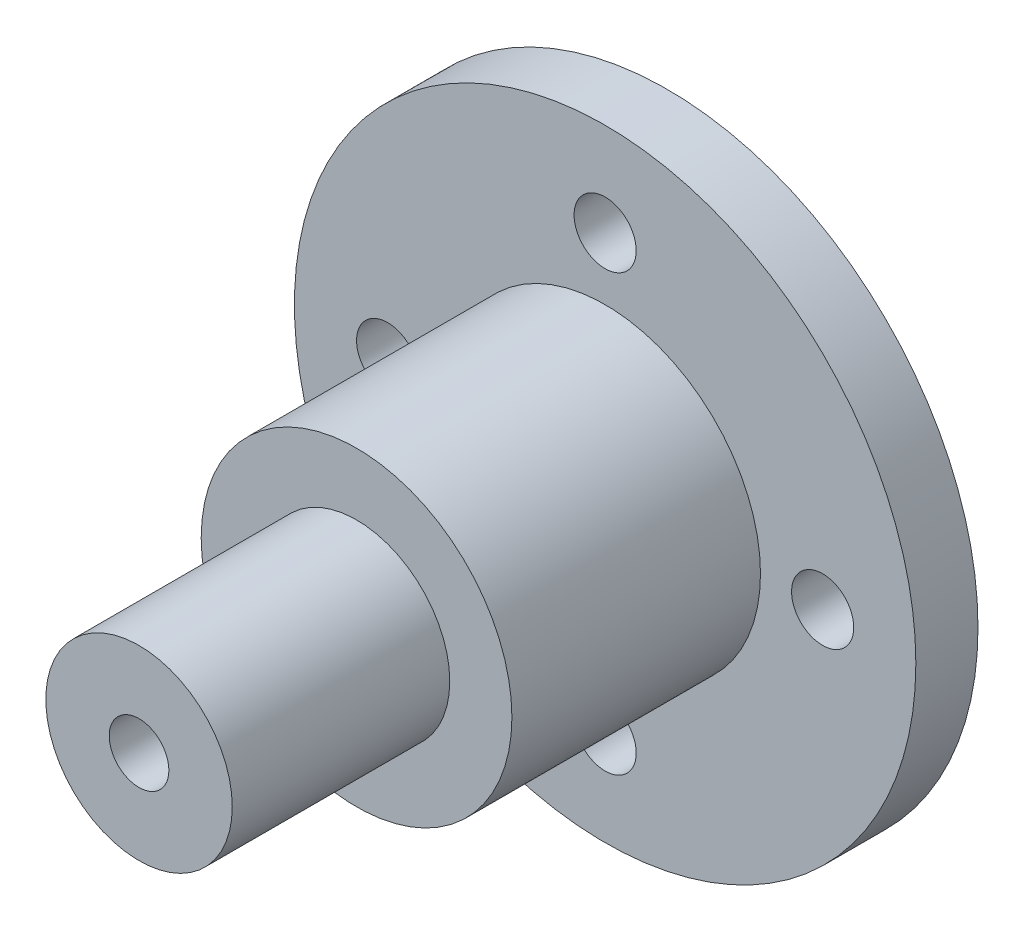
ISO-10303-21;
HEADER;
FILE_DESCRIPTION(('STEP AP214'),'2;1');
FILE_NAME('part.step','',(''),(''),'','','');
FILE_SCHEMA(('AUTOMOTIVE_DESIGN { 1 0 10303 214 1 1 1 1 }'));
ENDSEC;
DATA;
#1=APPLICATION_CONTEXT('core data for automotive mechanical design processes');
#2=APPLICATION_PROTOCOL_DEFINITION('international standard','automotive_design',2000,#1);
#3=PRODUCT_CONTEXT('',#1,'mechanical');
#4=PRODUCT('Part','Part','',(#3));
#5=PRODUCT_RELATED_PRODUCT_CATEGORY('part','',(#4));
#6=PRODUCT_DEFINITION_FORMATION('','',#4);
#7=PRODUCT_DEFINITION_CONTEXT('part definition',#1,'design');
#8=PRODUCT_DEFINITION('design','',#6,#7);
#9=PRODUCT_DEFINITION_SHAPE('','',#8);
#10=(LENGTH_UNIT() NAMED_UNIT(*) SI_UNIT(.MILLI.,.METRE.));
#11=(NAMED_UNIT(*) PLANE_ANGLE_UNIT() SI_UNIT($,.RADIAN.));
#12=(NAMED_UNIT(*) SI_UNIT($,.STERADIAN.) SOLID_ANGLE_UNIT());
#13=UNCERTAINTY_MEASURE_WITH_UNIT(LENGTH_MEASURE(1.E-05),#10,'distance_accuracy_value','');
#14=(GEOMETRIC_REPRESENTATION_CONTEXT(3) GLOBAL_UNCERTAINTY_ASSIGNED_CONTEXT((#13)) GLOBAL_UNIT_ASSIGNED_CONTEXT((#10,
#11,#12)) REPRESENTATION_CONTEXT('',''));
#15=CARTESIAN_POINT('',(0.,0.,0.));
#16=DIRECTION('',(0.,0.,1.));
#17=DIRECTION('',(1.,0.,0.));
#18=AXIS2_PLACEMENT_3D('',#15,#16,#17);
#19=CARTESIAN_POINT('',(0.,17.5,5.));
#20=DIRECTION('',(0.,0.,-1.));
#21=DIRECTION('',(-1.,0.,0.));
#22=AXIS2_PLACEMENT_3D('',#19,#20,#21);
#23=CYLINDRICAL_SURFACE('',#22,2.5);
#24=CARTESIAN_POINT('',(0.,17.5,5.));
#25=DIRECTION('',(0.,0.,1.));
#26=DIRECTION('',(1.,0.,0.));
#27=AXIS2_PLACEMENT_3D('',#24,#25,#26);
#28=CIRCLE('',#27,2.5);
#29=CARTESIAN_POINT('',(2.5,17.5,5.));
#30=VERTEX_POINT('',#29);
#31=EDGE_CURVE('E43',#30,#30,#28,.T.);
#32=ORIENTED_EDGE('',*,*,#31,.T.);
#33=EDGE_LOOP('',(#32));
#34=FACE_BOUND('',#33,.T.);
#35=CARTESIAN_POINT('',(0.,17.5,0.));
#36=DIRECTION('',(0.,0.,1.));
#37=DIRECTION('',(1.,0.,0.));
#38=AXIS2_PLACEMENT_3D('',#35,#36,#37);
#39=CIRCLE('',#38,2.5);
#40=CARTESIAN_POINT('',(2.5,17.5,0.));
#41=VERTEX_POINT('',#40);
#42=EDGE_CURVE('E74',#41,#41,#39,.T.);
#43=ORIENTED_EDGE('',*,*,#42,.F.);
#44=EDGE_LOOP('',(#43));
#45=FACE_BOUND('',#44,.T.);
#46=ADVANCED_FACE('F30',(#34,#45),#23,.F.);
#47=CARTESIAN_POINT('',(17.5,0.,5.));
#48=DIRECTION('',(0.,0.,-1.));
#49=DIRECTION('',(-1.,0.,0.));
#50=AXIS2_PLACEMENT_3D('',#47,#48,#49);
#51=CYLINDRICAL_SURFACE('',#50,2.5);
#52=CARTESIAN_POINT('',(17.5,0.,5.));
#53=DIRECTION('',(0.,0.,1.));
#54=DIRECTION('',(1.,0.,0.));
#55=AXIS2_PLACEMENT_3D('',#52,#53,#54);
#56=CIRCLE('',#55,2.5);
#57=CARTESIAN_POINT('',(20.,0.,5.));
#58=VERTEX_POINT('',#57);
#59=EDGE_CURVE('E62',#58,#58,#56,.T.);
#60=ORIENTED_EDGE('',*,*,#59,.T.);
#61=EDGE_LOOP('',(#60));
#62=FACE_BOUND('',#61,.T.);
#63=CARTESIAN_POINT('',(17.5,0.,0.));
#64=DIRECTION('',(0.,0.,1.));
#65=DIRECTION('',(1.,0.,0.));
#66=AXIS2_PLACEMENT_3D('',#63,#64,#65);
#67=CIRCLE('',#66,2.5);
#68=CARTESIAN_POINT('',(20.,0.,0.));
#69=VERTEX_POINT('',#68);
#70=EDGE_CURVE('E72',#69,#69,#67,.T.);
#71=ORIENTED_EDGE('',*,*,#70,.F.);
#72=EDGE_LOOP('',(#71));
#73=FACE_BOUND('',#72,.T.);
#74=ADVANCED_FACE('F101',(#62,#73),#51,.F.);
#75=CARTESIAN_POINT('',(-1.2220184685951E-13,-17.5,5.));
#76=DIRECTION('',(0.,0.,-1.));
#77=DIRECTION('',(-1.,0.,0.));
#78=AXIS2_PLACEMENT_3D('',#75,#76,#77);
#79=CYLINDRICAL_SURFACE('',#78,2.5);
#80=CARTESIAN_POINT('',(-1.2220184685951E-13,-17.5,5.));
#81=DIRECTION('',(0.,0.,1.));
#82=DIRECTION('',(1.,0.,0.));
#83=AXIS2_PLACEMENT_3D('',#80,#81,#82);
#84=CIRCLE('',#83,2.5);
#85=CARTESIAN_POINT('',(2.49999999999988,-17.5,5.));
#86=VERTEX_POINT('',#85);
#87=EDGE_CURVE('E59',#86,#86,#84,.T.);
#88=ORIENTED_EDGE('',*,*,#87,.T.);
#89=EDGE_LOOP('',(#88));
#90=FACE_BOUND('',#89,.T.);
#91=CARTESIAN_POINT('',(-1.2220184685951E-13,-17.5,0.));
#92=DIRECTION('',(0.,0.,1.));
#93=DIRECTION('',(1.,0.,0.));
#94=AXIS2_PLACEMENT_3D('',#91,#92,#93);
#95=CIRCLE('',#94,2.5);
#96=CARTESIAN_POINT('',(2.49999999999988,-17.5,0.));
#97=VERTEX_POINT('',#96);
#98=EDGE_CURVE('E69',#97,#97,#95,.T.);
#99=ORIENTED_EDGE('',*,*,#98,.F.);
#100=EDGE_LOOP('',(#99));
#101=FACE_BOUND('',#100,.T.);
#102=ADVANCED_FACE('F107',(#90,#101),#79,.F.);
#103=CARTESIAN_POINT('',(-17.5,1.83302770289265E-13,5.));
#104=DIRECTION('',(0.,0.,-1.));
#105=DIRECTION('',(-1.,0.,0.));
#106=AXIS2_PLACEMENT_3D('',#103,#104,#105);
#107=CYLINDRICAL_SURFACE('',#106,2.5);
#108=CARTESIAN_POINT('',(-17.5,1.83302770289265E-13,5.));
#109=DIRECTION('',(0.,0.,1.));
#110=DIRECTION('',(1.,0.,0.));
#111=AXIS2_PLACEMENT_3D('',#108,#109,#110);
#112=CIRCLE('',#111,2.5);
#113=CARTESIAN_POINT('',(-15.,1.83302770289265E-13,5.));
#114=VERTEX_POINT('',#113);
#115=EDGE_CURVE('E56',#114,#114,#112,.T.);
#116=ORIENTED_EDGE('',*,*,#115,.T.);
#117=EDGE_LOOP('',(#116));
#118=FACE_BOUND('',#117,.T.);
#119=CARTESIAN_POINT('',(-17.5,1.83302770289265E-13,0.));
#120=DIRECTION('',(0.,0.,1.));
#121=DIRECTION('',(1.,0.,0.));
#122=AXIS2_PLACEMENT_3D('',#119,#120,#121);
#123=CIRCLE('',#122,2.5);
#124=CARTESIAN_POINT('',(-15.,1.83302770289265E-13,0.));
#125=VERTEX_POINT('',#124);
#126=EDGE_CURVE('E52',#125,#125,#123,.T.);
#127=ORIENTED_EDGE('',*,*,#126,.F.);
#128=EDGE_LOOP('',(#127));
#129=FACE_BOUND('',#128,.T.);
#130=ADVANCED_FACE('F32',(#118,#129),#107,.F.);
#131=CARTESIAN_POINT('',(0.,0.,5.));
#132=DIRECTION('',(0.,0.,-1.));
#133=DIRECTION('',(-1.,0.,0.));
#134=AXIS2_PLACEMENT_3D('',#131,#132,#133);
#135=CYLINDRICAL_SURFACE('',#134,25.);
#136=CARTESIAN_POINT('',(0.,0.,5.));
#137=DIRECTION('',(0.,0.,1.));
#138=DIRECTION('',(1.,0.,0.));
#139=AXIS2_PLACEMENT_3D('',#136,#137,#138);
#140=CIRCLE('',#139,25.);
#141=CARTESIAN_POINT('',(25.,0.,5.));
#142=VERTEX_POINT('',#141);
#143=EDGE_CURVE('E38',#142,#142,#140,.T.);
#144=ORIENTED_EDGE('',*,*,#143,.F.);
#145=EDGE_LOOP('',(#144));
#146=FACE_BOUND('',#145,.T.);
#147=CARTESIAN_POINT('',(0.,0.,0.));
#148=DIRECTION('',(0.,0.,1.));
#149=DIRECTION('',(1.,0.,0.));
#150=AXIS2_PLACEMENT_3D('',#147,#148,#149);
#151=CIRCLE('',#150,25.);
#152=CARTESIAN_POINT('',(25.,0.,0.));
#153=VERTEX_POINT('',#152);
#154=EDGE_CURVE('E34',#153,#153,#151,.T.);
#155=ORIENTED_EDGE('',*,*,#154,.T.);
#156=EDGE_LOOP('',(#155));
#157=FACE_BOUND('',#156,.T.);
#158=ADVANCED_FACE('F81',(#146,#157),#135,.T.);
#159=CARTESIAN_POINT('',(0.,0.,5.));
#160=DIRECTION('',(0.,0.,1.));
#161=DIRECTION('',(1.,0.,0.));
#162=AXIS2_PLACEMENT_3D('',#159,#160,#161);
#163=PLANE('',#162);
#164=CARTESIAN_POINT('',(0.,0.,5.));
#165=DIRECTION('',(0.,0.,1.));
#166=DIRECTION('',(1.,0.,0.));
#167=AXIS2_PLACEMENT_3D('',#164,#165,#166);
#168=CIRCLE('',#167,12.5);
#169=CARTESIAN_POINT('',(12.5,0.,5.));
#170=VERTEX_POINT('',#169);
#171=EDGE_CURVE('E53',#170,#170,#168,.T.);
#172=ORIENTED_EDGE('',*,*,#171,.F.);
#173=EDGE_LOOP('',(#172));
#174=FACE_BOUND('',#173,.T.);
#175=ORIENTED_EDGE('',*,*,#115,.F.);
#176=EDGE_LOOP('',(#175));
#177=FACE_BOUND('',#176,.T.);
#178=ORIENTED_EDGE('',*,*,#87,.F.);
#179=EDGE_LOOP('',(#178));
#180=FACE_BOUND('',#179,.T.);
#181=ORIENTED_EDGE('',*,*,#59,.F.);
#182=EDGE_LOOP('',(#181));
#183=FACE_BOUND('',#182,.T.);
#184=ORIENTED_EDGE('',*,*,#31,.F.);
#185=EDGE_LOOP('',(#184));
#186=FACE_BOUND('',#185,.T.);
#187=ORIENTED_EDGE('',*,*,#143,.T.);
#188=EDGE_LOOP('',(#187));
#189=FACE_BOUND('',#188,.T.);
#190=ADVANCED_FACE('F86',(#174,#177,#180,#183,#186,#189),#163,.T.);
#191=CARTESIAN_POINT('',(0.,0.,0.));
#192=DIRECTION('',(0.,0.,1.));
#193=DIRECTION('',(1.,0.,0.));
#194=AXIS2_PLACEMENT_3D('',#191,#192,#193);
#195=PLANE('',#194);
#196=ORIENTED_EDGE('',*,*,#126,.T.);
#197=EDGE_LOOP('',(#196));
#198=FACE_BOUND('',#197,.T.);
#199=ORIENTED_EDGE('',*,*,#98,.T.);
#200=EDGE_LOOP('',(#199));
#201=FACE_BOUND('',#200,.T.);
#202=ORIENTED_EDGE('',*,*,#70,.T.);
#203=EDGE_LOOP('',(#202));
#204=FACE_BOUND('',#203,.T.);
#205=ORIENTED_EDGE('',*,*,#42,.T.);
#206=EDGE_LOOP('',(#205));
#207=FACE_BOUND('',#206,.T.);
#208=ORIENTED_EDGE('',*,*,#154,.F.);
#209=EDGE_LOOP('',(#208));
#210=FACE_BOUND('',#209,.T.);
#211=ADVANCED_FACE('F83',(#198,#201,#204,#207,#210),#195,.F.);
#212=CARTESIAN_POINT('',(0.,0.,25.));
#213=DIRECTION('',(0.,0.,-1.));
#214=DIRECTION('',(-1.,0.,0.));
#215=AXIS2_PLACEMENT_3D('',#212,#213,#214);
#216=CYLINDRICAL_SURFACE('',#215,12.5);
#217=CARTESIAN_POINT('',(0.,0.,25.));
#218=DIRECTION('',(0.,0.,1.));
#219=DIRECTION('',(1.,0.,0.));
#220=AXIS2_PLACEMENT_3D('',#217,#218,#219);
#221=CIRCLE('',#220,12.5);
#222=CARTESIAN_POINT('',(12.5,0.,25.));
#223=VERTEX_POINT('',#222);
#224=EDGE_CURVE('E49',#223,#223,#221,.T.);
#225=ORIENTED_EDGE('',*,*,#224,.F.);
#226=EDGE_LOOP('',(#225));
#227=FACE_BOUND('',#226,.T.);
#228=ORIENTED_EDGE('',*,*,#171,.T.);
#229=EDGE_LOOP('',(#228));
#230=FACE_BOUND('',#229,.T.);
#231=ADVANCED_FACE('F85',(#227,#230),#216,.T.);
#232=CARTESIAN_POINT('',(0.,0.,25.));
#233=DIRECTION('',(0.,0.,1.));
#234=DIRECTION('',(1.,0.,0.));
#235=AXIS2_PLACEMENT_3D('',#232,#233,#234);
#236=PLANE('',#235);
#237=CARTESIAN_POINT('',(0.,0.,25.));
#238=DIRECTION('',(0.,0.,1.));
#239=DIRECTION('',(1.,0.,0.));
#240=AXIS2_PLACEMENT_3D('',#237,#238,#239);
#241=CIRCLE('',#240,7.5);
#242=CARTESIAN_POINT('',(7.5,0.,25.));
#243=VERTEX_POINT('',#242);
#244=EDGE_CURVE('E10',#243,#243,#241,.T.);
#245=ORIENTED_EDGE('',*,*,#244,.F.);
#246=EDGE_LOOP('',(#245));
#247=FACE_BOUND('',#246,.T.);
#248=ORIENTED_EDGE('',*,*,#224,.T.);
#249=EDGE_LOOP('',(#248));
#250=FACE_BOUND('',#249,.T.);
#251=ADVANCED_FACE('F93',(#247,#250),#236,.T.);
#252=CARTESIAN_POINT('',(0.,0.,42.5));
#253=DIRECTION('',(0.,0.,-1.));
#254=DIRECTION('',(-1.,0.,0.));
#255=AXIS2_PLACEMENT_3D('',#252,#253,#254);
#256=CYLINDRICAL_SURFACE('',#255,7.5);
#257=CARTESIAN_POINT('',(0.,0.,42.5));
#258=DIRECTION('',(0.,0.,1.));
#259=DIRECTION('',(1.,0.,0.));
#260=AXIS2_PLACEMENT_3D('',#257,#258,#259);
#261=CIRCLE('',#260,7.5);
#262=CARTESIAN_POINT('',(7.5,0.,42.5));
#263=VERTEX_POINT('',#262);
#264=EDGE_CURVE('E47',#263,#263,#261,.T.);
#265=ORIENTED_EDGE('',*,*,#264,.F.);
#266=EDGE_LOOP('',(#265));
#267=FACE_BOUND('',#266,.T.);
#268=ORIENTED_EDGE('',*,*,#244,.T.);
#269=EDGE_LOOP('',(#268));
#270=FACE_BOUND('',#269,.T.);
#271=ADVANCED_FACE('F157',(#267,#270),#256,.T.);
#272=CARTESIAN_POINT('',(0.,0.,42.5));
#273=DIRECTION('',(0.,0.,1.));
#274=DIRECTION('',(1.,0.,0.));
#275=AXIS2_PLACEMENT_3D('',#272,#273,#274);
#276=PLANE('',#275);
#277=CARTESIAN_POINT('',(0.,0.,42.5));
#278=DIRECTION('',(0.,0.,1.));
#279=DIRECTION('',(1.,0.,0.));
#280=AXIS2_PLACEMENT_3D('',#277,#278,#279);
#281=CIRCLE('',#280,2.4);
#282=CARTESIAN_POINT('',(2.4,0.,42.5));
#283=VERTEX_POINT('',#282);
#284=EDGE_CURVE('E204',#283,#283,#281,.T.);
#285=ORIENTED_EDGE('',*,*,#284,.F.);
#286=EDGE_LOOP('',(#285));
#287=FACE_BOUND('',#286,.T.);
#288=ORIENTED_EDGE('',*,*,#264,.T.);
#289=EDGE_LOOP('',(#288));
#290=FACE_BOUND('',#289,.T.);
#291=ADVANCED_FACE('F167',(#287,#290),#276,.T.);
#292=CARTESIAN_POINT('',(0.,0.,32.5));
#293=DIRECTION('',(0.,0.,1.));
#294=DIRECTION('',(1.,0.,0.));
#295=AXIS2_PLACEMENT_3D('',#292,#293,#294);
#296=CYLINDRICAL_SURFACE('',#295,2.4);
#297=CARTESIAN_POINT('',(0.,0.,32.5));
#298=DIRECTION('',(0.,0.,1.));
#299=DIRECTION('',(1.,0.,0.));
#300=AXIS2_PLACEMENT_3D('',#297,#298,#299);
#301=CIRCLE('',#300,2.4);
#302=CARTESIAN_POINT('',(2.4,0.,32.5));
#303=VERTEX_POINT('',#302);
#304=EDGE_CURVE('E203',#303,#303,#301,.T.);
#305=ORIENTED_EDGE('',*,*,#304,.F.);
#306=EDGE_LOOP('',(#305));
#307=FACE_BOUND('',#306,.T.);
#308=ORIENTED_EDGE('',*,*,#284,.T.);
#309=EDGE_LOOP('',(#308));
#310=FACE_BOUND('',#309,.T.);
#311=ADVANCED_FACE('F177',(#307,#310),#296,.F.);
#312=CARTESIAN_POINT('',(0.,0.,32.5));
#313=DIRECTION('',(0.,0.,1.));
#314=DIRECTION('',(1.,0.,0.));
#315=AXIS2_PLACEMENT_3D('',#312,#313,#314);
#316=PLANE('',#315);
#317=ORIENTED_EDGE('',*,*,#304,.T.);
#318=EDGE_LOOP('',(#317));
#319=FACE_BOUND('',#318,.T.);
#320=ADVANCED_FACE('F187',(#319),#316,.T.);
#321=CLOSED_SHELL('',(#46,#74,#102,#130,#158,#190,#211,#231,#251,#271,#291,#311,#320));
#322=MANIFOLD_SOLID_BREP('B2',#321);
#323=ADVANCED_BREP_SHAPE_REPRESENTATION('',(#18,#322),#14);
#324=SHAPE_DEFINITION_REPRESENTATION(#9,#323);
ENDSEC;
END-ISO-10303-21;
